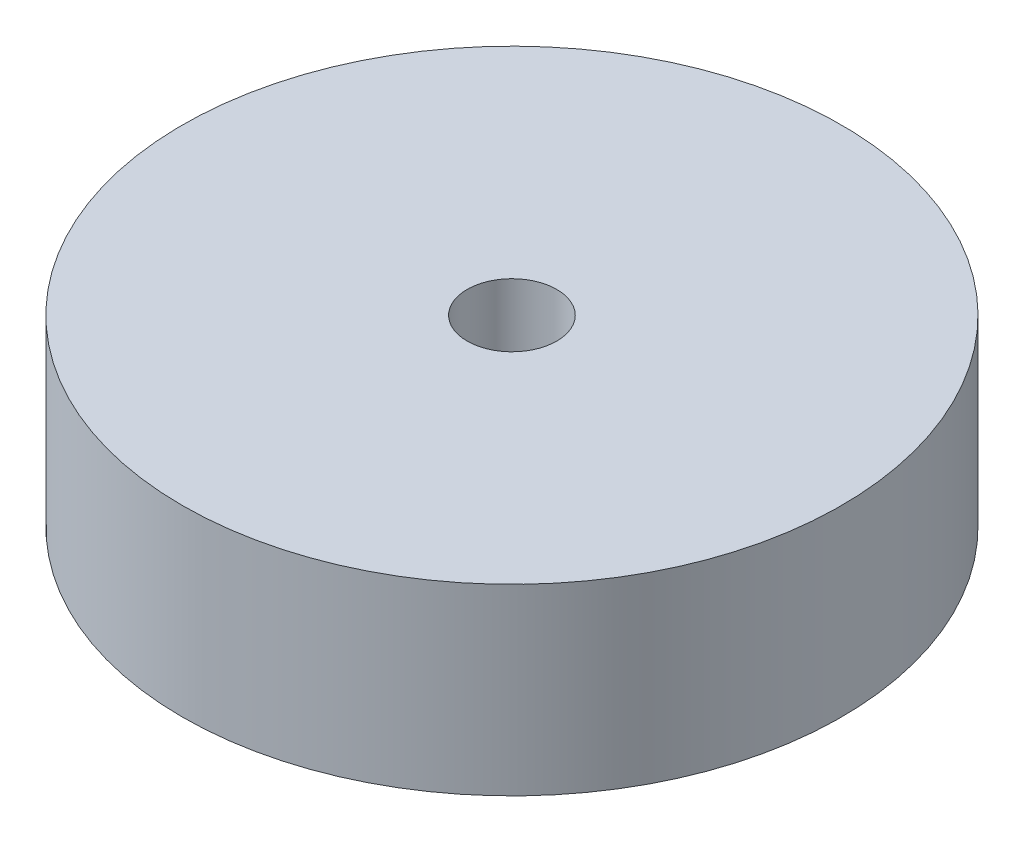
ISO-10303-21;
HEADER;
FILE_DESCRIPTION(('STEP AP214'),'2;1');
FILE_NAME('part.step','',(''),(''),'','','');
FILE_SCHEMA(('AUTOMOTIVE_DESIGN { 1 0 10303 214 1 1 1 1 }'));
ENDSEC;
DATA;
#1=APPLICATION_CONTEXT('core data for automotive mechanical design processes');
#2=APPLICATION_PROTOCOL_DEFINITION('international standard','automotive_design',2000,#1);
#3=PRODUCT_CONTEXT('',#1,'mechanical');
#4=PRODUCT('Part','Part','',(#3));
#5=PRODUCT_RELATED_PRODUCT_CATEGORY('part','',(#4));
#6=PRODUCT_DEFINITION_FORMATION('','',#4);
#7=PRODUCT_DEFINITION_CONTEXT('part definition',#1,'design');
#8=PRODUCT_DEFINITION('design','',#6,#7);
#9=PRODUCT_DEFINITION_SHAPE('','',#8);
#10=(LENGTH_UNIT() NAMED_UNIT(*) SI_UNIT(.MILLI.,.METRE.));
#11=(NAMED_UNIT(*) PLANE_ANGLE_UNIT() SI_UNIT($,.RADIAN.));
#12=(NAMED_UNIT(*) SI_UNIT($,.STERADIAN.) SOLID_ANGLE_UNIT());
#13=UNCERTAINTY_MEASURE_WITH_UNIT(LENGTH_MEASURE(1.E-05),#10,'distance_accuracy_value','');
#14=(GEOMETRIC_REPRESENTATION_CONTEXT(3) GLOBAL_UNCERTAINTY_ASSIGNED_CONTEXT((#13)) GLOBAL_UNIT_ASSIGNED_CONTEXT((#10,
#11,#12)) REPRESENTATION_CONTEXT('',''));
#15=CARTESIAN_POINT('',(0.,0.,0.));
#16=DIRECTION('',(0.,0.,1.));
#17=DIRECTION('',(1.,0.,0.));
#18=AXIS2_PLACEMENT_3D('',#15,#16,#17);
#19=CARTESIAN_POINT('',(-157.616541964751,20.32,-28.1651552651788));
#20=DIRECTION('',(0.,-1.,0.));
#21=DIRECTION('',(0.,0.,-1.));
#22=AXIS2_PLACEMENT_3D('',#19,#20,#21);
#23=CYLINDRICAL_SURFACE('',#22,36.5474963347691);
#24=CARTESIAN_POINT('',(-157.616541964751,20.32,-28.1651552651788));
#25=DIRECTION('',(0.,1.,0.));
#26=DIRECTION('',(0.,0.,1.));
#27=AXIS2_PLACEMENT_3D('',#24,#25,#26);
#28=CIRCLE('',#27,36.5474963347691);
#29=CARTESIAN_POINT('',(-157.616541964751,20.32,8.38234106959028));
#30=VERTEX_POINT('',#29);
#31=EDGE_CURVE('E10',#30,#30,#28,.T.);
#32=ORIENTED_EDGE('',*,*,#31,.F.);
#33=EDGE_LOOP('',(#32));
#34=FACE_BOUND('',#33,.T.);
#35=CARTESIAN_POINT('',(-157.616541964751,0.,-28.1651552651788));
#36=DIRECTION('',(0.,1.,0.));
#37=DIRECTION('',(0.,0.,1.));
#38=AXIS2_PLACEMENT_3D('',#35,#36,#37);
#39=CIRCLE('',#38,36.5474963347691);
#40=CARTESIAN_POINT('',(-157.616541964751,0.,8.38234106959028));
#41=VERTEX_POINT('',#40);
#42=EDGE_CURVE('E40',#41,#41,#39,.T.);
#43=ORIENTED_EDGE('',*,*,#42,.T.);
#44=EDGE_LOOP('',(#43));
#45=FACE_BOUND('',#44,.T.);
#46=ADVANCED_FACE('F33',(#34,#45),#23,.T.);
#47=CARTESIAN_POINT('',(-157.616541964751,20.32,-28.1651552651788));
#48=DIRECTION('',(0.,1.,0.));
#49=DIRECTION('',(0.,0.,1.));
#50=AXIS2_PLACEMENT_3D('',#47,#48,#49);
#51=PLANE('',#50);
#52=CARTESIAN_POINT('',(-157.616541964751,20.32,-28.1651552651788));
#53=DIRECTION('',(0.,1.,0.));
#54=DIRECTION('',(0.,0.,1.));
#55=AXIS2_PLACEMENT_3D('',#52,#53,#54);
#56=CIRCLE('',#55,4.9687198624953);
#57=CARTESIAN_POINT('',(-157.616541964751,20.32,-23.1964354026835));
#58=VERTEX_POINT('',#57);
#59=EDGE_CURVE('E46',#58,#58,#56,.T.);
#60=ORIENTED_EDGE('',*,*,#59,.F.);
#61=EDGE_LOOP('',(#60));
#62=FACE_BOUND('',#61,.T.);
#63=ORIENTED_EDGE('',*,*,#31,.T.);
#64=EDGE_LOOP('',(#63));
#65=FACE_BOUND('',#64,.T.);
#66=ADVANCED_FACE('F62',(#62,#65),#51,.T.);
#67=CARTESIAN_POINT('',(-157.616541964751,0.,-28.1651552651788));
#68=DIRECTION('',(0.,1.,0.));
#69=DIRECTION('',(0.,0.,1.));
#70=AXIS2_PLACEMENT_3D('',#67,#68,#69);
#71=PLANE('',#70);
#72=CARTESIAN_POINT('',(-157.616541964751,0.,-28.1651552651788));
#73=DIRECTION('',(0.,1.,0.));
#74=DIRECTION('',(0.,0.,1.));
#75=AXIS2_PLACEMENT_3D('',#72,#73,#74);
#76=CIRCLE('',#75,4.9687198624953);
#77=CARTESIAN_POINT('',(-157.616541964751,0.,-23.1964354026835));
#78=VERTEX_POINT('',#77);
#79=EDGE_CURVE('E36',#78,#78,#76,.T.);
#80=ORIENTED_EDGE('',*,*,#79,.T.);
#81=EDGE_LOOP('',(#80));
#82=FACE_BOUND('',#81,.T.);
#83=ORIENTED_EDGE('',*,*,#42,.F.);
#84=EDGE_LOOP('',(#83));
#85=FACE_BOUND('',#84,.T.);
#86=ADVANCED_FACE('F53',(#82,#85),#71,.F.);
#87=CARTESIAN_POINT('',(-157.616541964751,-14.224,-28.1651552651788));
#88=DIRECTION('',(0.,1.,0.));
#89=DIRECTION('',(0.,0.,1.));
#90=AXIS2_PLACEMENT_3D('',#87,#88,#89);
#91=CYLINDRICAL_SURFACE('',#90,4.9687198624953);
#92=ORIENTED_EDGE('',*,*,#59,.T.);
#93=EDGE_LOOP('',(#92));
#94=FACE_BOUND('',#93,.T.);
#95=ORIENTED_EDGE('',*,*,#79,.F.);
#96=EDGE_LOOP('',(#95));
#97=FACE_BOUND('',#96,.T.);
#98=ADVANCED_FACE('F56',(#94,#97),#91,.F.);
#99=CLOSED_SHELL('',(#46,#66,#86,#98));
#100=MANIFOLD_SOLID_BREP('B2',#99);
#101=ADVANCED_BREP_SHAPE_REPRESENTATION('',(#18,#100),#14);
#102=SHAPE_DEFINITION_REPRESENTATION(#9,#101);
ENDSEC;
END-ISO-10303-21;
